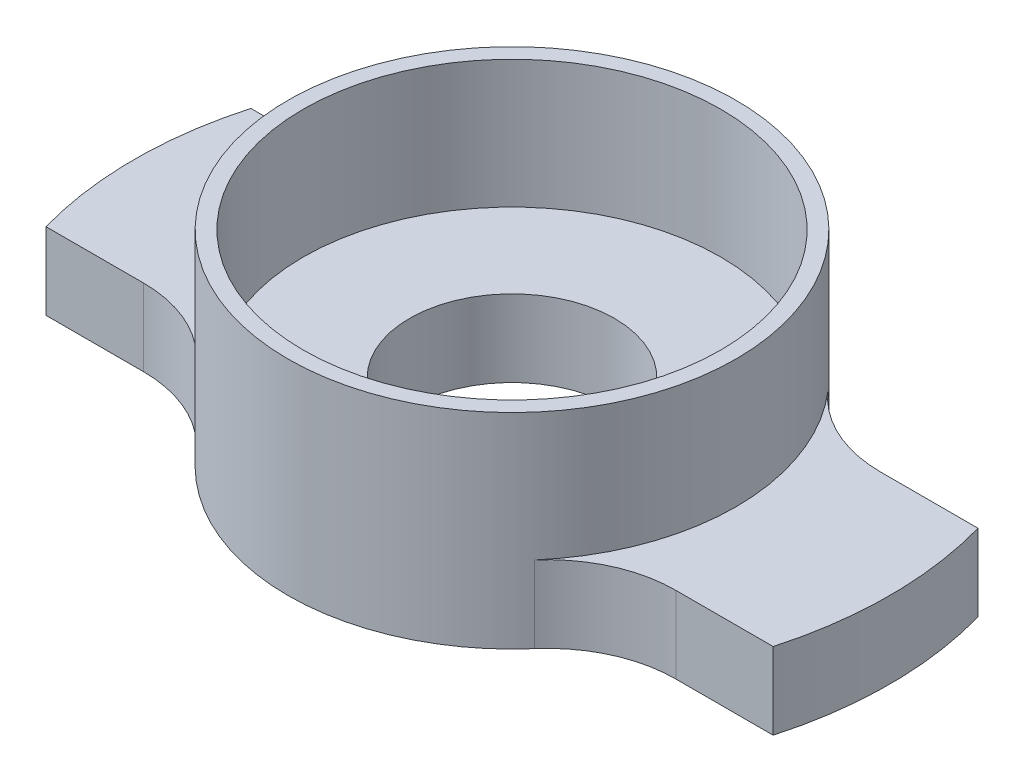
ISO-10303-21;
HEADER;
FILE_DESCRIPTION(('STEP AP214'),'2;1');
FILE_NAME('part.step','',(''),(''),'','','');
FILE_SCHEMA(('AUTOMOTIVE_DESIGN { 1 0 10303 214 1 1 1 1 }'));
ENDSEC;
DATA;
#1=APPLICATION_CONTEXT('core data for automotive mechanical design processes');
#2=APPLICATION_PROTOCOL_DEFINITION('international standard','automotive_design',2000,#1);
#3=PRODUCT_CONTEXT('',#1,'mechanical');
#4=PRODUCT('Part','Part','',(#3));
#5=PRODUCT_RELATED_PRODUCT_CATEGORY('part','',(#4));
#6=PRODUCT_DEFINITION_FORMATION('','',#4);
#7=PRODUCT_DEFINITION_CONTEXT('part definition',#1,'design');
#8=PRODUCT_DEFINITION('design','',#6,#7);
#9=PRODUCT_DEFINITION_SHAPE('','',#8);
#10=(LENGTH_UNIT() NAMED_UNIT(*) SI_UNIT(.MILLI.,.METRE.));
#11=(NAMED_UNIT(*) PLANE_ANGLE_UNIT() SI_UNIT($,.RADIAN.));
#12=(NAMED_UNIT(*) SI_UNIT($,.STERADIAN.) SOLID_ANGLE_UNIT());
#13=UNCERTAINTY_MEASURE_WITH_UNIT(LENGTH_MEASURE(1.E-05),#10,'distance_accuracy_value','');
#14=(GEOMETRIC_REPRESENTATION_CONTEXT(3) GLOBAL_UNCERTAINTY_ASSIGNED_CONTEXT((#13)) GLOBAL_UNIT_ASSIGNED_CONTEXT((#10,
#11,#12)) REPRESENTATION_CONTEXT('',''));
#15=CARTESIAN_POINT('',(0.,0.,0.));
#16=DIRECTION('',(0.,0.,1.));
#17=DIRECTION('',(1.,0.,0.));
#18=AXIS2_PLACEMENT_3D('',#15,#16,#17);
#19=CARTESIAN_POINT('',(0.,10.,0.));
#20=DIRECTION('',(0.,1.,0.));
#21=DIRECTION('',(0.,0.,1.));
#22=AXIS2_PLACEMENT_3D('',#19,#20,#21);
#23=PLANE('',#22);
#24=CARTESIAN_POINT('',(0.,10.,0.));
#25=DIRECTION('',(0.,1.,0.));
#26=DIRECTION('',(0.,0.,1.));
#27=AXIS2_PLACEMENT_3D('',#24,#25,#26);
#28=CIRCLE('',#27,17.5);
#29=CARTESIAN_POINT('',(0.,10.,17.5));
#30=VERTEX_POINT('',#29);
#31=EDGE_CURVE('E192',#30,#30,#28,.T.);
#32=ORIENTED_EDGE('',*,*,#31,.T.);
#33=EDGE_LOOP('',(#32));
#34=FACE_BOUND('',#33,.T.);
#35=CARTESIAN_POINT('',(0.,10.,0.));
#36=DIRECTION('',(0.,1.,0.));
#37=DIRECTION('',(0.,0.,1.));
#38=AXIS2_PLACEMENT_3D('',#35,#36,#37);
#39=CIRCLE('',#38,16.3);
#40=CARTESIAN_POINT('',(0.,10.,16.3));
#41=VERTEX_POINT('',#40);
#42=EDGE_CURVE('E189',#41,#41,#39,.T.);
#43=ORIENTED_EDGE('',*,*,#42,.F.);
#44=EDGE_LOOP('',(#43));
#45=FACE_BOUND('',#44,.T.);
#46=ADVANCED_FACE('F33',(#34,#45),#23,.T.);
#47=CARTESIAN_POINT('',(0.,10.,0.));
#48=DIRECTION('',(0.,-1.,0.));
#49=DIRECTION('',(0.,0.,-1.));
#50=AXIS2_PLACEMENT_3D('',#47,#48,#49);
#51=CYLINDRICAL_SURFACE('',#50,17.5);
#52=ORIENTED_EDGE('',*,*,#31,.F.);
#53=EDGE_LOOP('',(#52));
#54=FACE_BOUND('',#53,.T.);
#55=CARTESIAN_POINT('',(0.,0.,0.));
#56=DIRECTION('',(0.,1.,0.));
#57=DIRECTION('',(0.,0.,1.));
#58=AXIS2_PLACEMENT_3D('',#55,#56,#57);
#59=CIRCLE('',#58,17.5);
#60=CARTESIAN_POINT('',(13.2303963821857,0.,11.4545454545455));
#61=VERTEX_POINT('',#60);
#62=CARTESIAN_POINT('',(13.2303963821857,0.,-11.4545454545455));
#63=VERTEX_POINT('',#62);
#64=EDGE_CURVE('E154',#61,#63,#59,.T.);
#65=ORIENTED_EDGE('',*,*,#64,.T.);
#66=DIRECTION('',(0.,-1.,0.));
#67=VECTOR('',#66,1.);
#68=CARTESIAN_POINT('',(13.2303963821857,10.,-11.4545454545455));
#69=LINE('',#68,#67);
#70=CARTESIAN_POINT('',(13.2303963821857,-6.,-11.4545454545455));
#71=VERTEX_POINT('',#70);
#72=EDGE_CURVE('E207',#63,#71,#69,.T.);
#73=ORIENTED_EDGE('',*,*,#72,.T.);
#74=CARTESIAN_POINT('',(0.,-6.,0.));
#75=DIRECTION('',(0.,-1.,0.));
#76=DIRECTION('',(0.,0.,-1.));
#77=AXIS2_PLACEMENT_3D('',#74,#75,#76);
#78=CIRCLE('',#77,17.5);
#79=CARTESIAN_POINT('',(-13.2303963821857,-6.,-11.4545454545455));
#80=VERTEX_POINT('',#79);
#81=EDGE_CURVE('E188',#80,#71,#78,.T.);
#82=ORIENTED_EDGE('',*,*,#81,.F.);
#83=DIRECTION('',(0.,-1.,0.));
#84=VECTOR('',#83,1.);
#85=CARTESIAN_POINT('',(-13.2303963821857,10.,-11.4545454545455));
#86=LINE('',#85,#84);
#87=CARTESIAN_POINT('',(-13.2303963821857,0.,-11.4545454545455));
#88=VERTEX_POINT('',#87);
#89=EDGE_CURVE('E201',#80,#88,#86,.F.);
#90=ORIENTED_EDGE('',*,*,#89,.T.);
#91=CARTESIAN_POINT('',(0.,0.,0.));
#92=DIRECTION('',(0.,-1.,0.));
#93=DIRECTION('',(0.,0.,-1.));
#94=AXIS2_PLACEMENT_3D('',#91,#92,#93);
#95=CIRCLE('',#94,17.5);
#96=CARTESIAN_POINT('',(-13.2303963821857,0.,11.4545454545455));
#97=VERTEX_POINT('',#96);
#98=EDGE_CURVE('E177',#97,#88,#95,.T.);
#99=ORIENTED_EDGE('',*,*,#98,.F.);
#100=DIRECTION('',(0.,-1.,0.));
#101=VECTOR('',#100,1.);
#102=CARTESIAN_POINT('',(-13.2303963821857,10.,11.4545454545455));
#103=LINE('',#102,#101);
#104=CARTESIAN_POINT('',(-13.2303963821857,-6.,11.4545454545455));
#105=VERTEX_POINT('',#104);
#106=EDGE_CURVE('E198',#97,#105,#103,.T.);
#107=ORIENTED_EDGE('',*,*,#106,.T.);
#108=CARTESIAN_POINT('',(13.2303963821857,-6.,11.4545454545455));
#109=VERTEX_POINT('',#108);
#110=EDGE_CURVE('E184',#109,#105,#78,.T.);
#111=ORIENTED_EDGE('',*,*,#110,.F.);
#112=DIRECTION('',(0.,-1.,0.));
#113=VECTOR('',#112,1.);
#114=CARTESIAN_POINT('',(13.2303963821857,10.,11.4545454545455));
#115=LINE('',#114,#113);
#116=EDGE_CURVE('E204',#109,#61,#115,.F.);
#117=ORIENTED_EDGE('',*,*,#116,.T.);
#118=EDGE_LOOP('',(#65,#73,#82,#90,#99,#107,#111,#117));
#119=FACE_BOUND('',#118,.T.);
#120=ADVANCED_FACE('F238',(#54,#119),#51,.T.);
#121=CARTESIAN_POINT('',(0.,10.,0.));
#122=DIRECTION('',(0.,-1.,0.));
#123=DIRECTION('',(0.,0.,-1.));
#124=AXIS2_PLACEMENT_3D('',#121,#122,#123);
#125=CYLINDRICAL_SURFACE('',#124,16.3);
#126=ORIENTED_EDGE('',*,*,#42,.T.);
#127=EDGE_LOOP('',(#126));
#128=FACE_BOUND('',#127,.T.);
#129=CARTESIAN_POINT('',(0.,0.,0.));
#130=DIRECTION('',(0.,1.,0.));
#131=DIRECTION('',(0.,0.,1.));
#132=AXIS2_PLACEMENT_3D('',#129,#130,#131);
#133=CIRCLE('',#132,16.3);
#134=CARTESIAN_POINT('',(0.,0.,16.3));
#135=VERTEX_POINT('',#134);
#136=EDGE_CURVE('E193',#135,#135,#133,.T.);
#137=ORIENTED_EDGE('',*,*,#136,.F.);
#138=EDGE_LOOP('',(#137));
#139=FACE_BOUND('',#138,.T.);
#140=ADVANCED_FACE('F282',(#128,#139),#125,.F.);
#141=CARTESIAN_POINT('',(0.,0.,0.));
#142=DIRECTION('',(0.,-1.,0.));
#143=DIRECTION('',(0.,0.,-1.));
#144=AXIS2_PLACEMENT_3D('',#141,#142,#143);
#145=PLANE('',#144);
#146=ORIENTED_EDGE('',*,*,#136,.T.);
#147=EDGE_LOOP('',(#146));
#148=FACE_BOUND('',#147,.T.);
#149=CARTESIAN_POINT('',(0.,0.,0.));
#150=DIRECTION('',(0.,-1.,0.));
#151=DIRECTION('',(0.,0.,-1.));
#152=AXIS2_PLACEMENT_3D('',#149,#150,#151);
#153=CIRCLE('',#152,8.);
#154=CARTESIAN_POINT('',(0.,0.,-8.));
#155=VERTEX_POINT('',#154);
#156=EDGE_CURVE('E180',#155,#155,#153,.T.);
#157=ORIENTED_EDGE('',*,*,#156,.T.);
#158=EDGE_LOOP('',(#157));
#159=FACE_BOUND('',#158,.T.);
#160=ADVANCED_FACE('F369',(#148,#159),#145,.F.);
#161=CARTESIAN_POINT('',(0.,-6.,0.));
#162=DIRECTION('',(0.,-1.,0.));
#163=DIRECTION('',(0.,0.,-1.));
#164=AXIS2_PLACEMENT_3D('',#161,#162,#163);
#165=PLANE('',#164);
#166=DIRECTION('',(1.,0.,0.));
#167=VECTOR('',#166,1.);
#168=CARTESIAN_POINT('',(-8.,-6.,-8.));
#169=LINE('',#168,#167);
#170=CARTESIAN_POINT('',(-28.3945417290014,-6.,-8.));
#171=VERTEX_POINT('',#170);
#172=CARTESIAN_POINT('',(-20.7906228862918,-6.,-8.));
#173=VERTEX_POINT('',#172);
#174=EDGE_CURVE('E170',#171,#173,#169,.T.);
#175=ORIENTED_EDGE('',*,*,#174,.T.);
#176=CARTESIAN_POINT('',(-20.7906228862918,-6.,-18.));
#177=DIRECTION('',(0.,-1.,0.));
#178=DIRECTION('',(0.,0.,-1.));
#179=AXIS2_PLACEMENT_3D('',#176,#177,#178);
#180=CIRCLE('',#179,10.);
#181=EDGE_CURVE('E227',#173,#80,#180,.F.);
#182=ORIENTED_EDGE('',*,*,#181,.T.);
#183=ORIENTED_EDGE('',*,*,#81,.T.);
#184=CARTESIAN_POINT('',(20.7906228862918,-6.,-18.));
#185=DIRECTION('',(0.,-1.,0.));
#186=DIRECTION('',(0.,0.,-1.));
#187=AXIS2_PLACEMENT_3D('',#184,#185,#186);
#188=CIRCLE('',#187,10.);
#189=CARTESIAN_POINT('',(20.7906228862918,-6.,-8.));
#190=VERTEX_POINT('',#189);
#191=EDGE_CURVE('E217',#71,#190,#188,.F.);
#192=ORIENTED_EDGE('',*,*,#191,.T.);
#193=DIRECTION('',(1.,0.,0.));
#194=VECTOR('',#193,1.);
#195=CARTESIAN_POINT('',(28.3945417290014,-6.,-8.));
#196=LINE('',#195,#194);
#197=CARTESIAN_POINT('',(28.3945417290014,-6.,-8.));
#198=VERTEX_POINT('',#197);
#199=EDGE_CURVE('E146',#190,#198,#196,.T.);
#200=ORIENTED_EDGE('',*,*,#199,.T.);
#201=CARTESIAN_POINT('',(0.,-6.,0.));
#202=DIRECTION('',(0.,-1.,0.));
#203=DIRECTION('',(0.,0.,1.));
#204=AXIS2_PLACEMENT_3D('',#201,#202,#203);
#205=CIRCLE('',#204,29.5);
#206=CARTESIAN_POINT('',(28.3945417290014,-6.,8.));
#207=VERTEX_POINT('',#206);
#208=EDGE_CURVE('E151',#198,#207,#205,.T.);
#209=ORIENTED_EDGE('',*,*,#208,.T.);
#210=DIRECTION('',(-1.,0.,0.));
#211=VECTOR('',#210,1.);
#212=CARTESIAN_POINT('',(8.,-6.,8.));
#213=LINE('',#212,#211);
#214=CARTESIAN_POINT('',(20.7906228862918,-6.,8.));
#215=VERTEX_POINT('',#214);
#216=EDGE_CURVE('E127',#207,#215,#213,.T.);
#217=ORIENTED_EDGE('',*,*,#216,.T.);
#218=CARTESIAN_POINT('',(20.7906228862918,-6.,18.));
#219=DIRECTION('',(0.,-1.,0.));
#220=DIRECTION('',(0.,0.,-1.));
#221=AXIS2_PLACEMENT_3D('',#218,#219,#220);
#222=CIRCLE('',#221,10.);
#223=EDGE_CURVE('E223',#215,#109,#222,.F.);
#224=ORIENTED_EDGE('',*,*,#223,.T.);
#225=ORIENTED_EDGE('',*,*,#110,.T.);
#226=CARTESIAN_POINT('',(-20.7906228862918,-6.,18.));
#227=DIRECTION('',(0.,-1.,0.));
#228=DIRECTION('',(0.,0.,-1.));
#229=AXIS2_PLACEMENT_3D('',#226,#227,#228);
#230=CIRCLE('',#229,10.);
#231=CARTESIAN_POINT('',(-20.7906228862918,-6.,8.));
#232=VERTEX_POINT('',#231);
#233=EDGE_CURVE('E41',#105,#232,#230,.F.);
#234=ORIENTED_EDGE('',*,*,#233,.T.);
#235=DIRECTION('',(-1.,0.,0.));
#236=VECTOR('',#235,1.);
#237=CARTESIAN_POINT('',(-28.3945417290014,-6.,8.));
#238=LINE('',#237,#236);
#239=CARTESIAN_POINT('',(-28.3945417290014,-6.,8.));
#240=VERTEX_POINT('',#239);
#241=EDGE_CURVE('E162',#232,#240,#238,.T.);
#242=ORIENTED_EDGE('',*,*,#241,.T.);
#243=CARTESIAN_POINT('',(0.,-6.,0.));
#244=DIRECTION('',(0.,-1.,0.));
#245=DIRECTION('',(0.,0.,-1.));
#246=AXIS2_PLACEMENT_3D('',#243,#244,#245);
#247=CIRCLE('',#246,29.5);
#248=EDGE_CURVE('E157',#240,#171,#247,.T.);
#249=ORIENTED_EDGE('',*,*,#248,.T.);
#250=EDGE_LOOP('',(#175,#182,#183,#192,#200,#209,#217,#224,#225,#234,#242,#249));
#251=FACE_BOUND('',#250,.T.);
#252=CARTESIAN_POINT('',(0.,-6.,0.));
#253=DIRECTION('',(0.,-1.,0.));
#254=DIRECTION('',(0.,0.,-1.));
#255=AXIS2_PLACEMENT_3D('',#252,#253,#254);
#256=CIRCLE('',#255,8.);
#257=CARTESIAN_POINT('',(0.,-6.,-8.));
#258=VERTEX_POINT('',#257);
#259=EDGE_CURVE('E181',#258,#258,#256,.T.);
#260=ORIENTED_EDGE('',*,*,#259,.F.);
#261=EDGE_LOOP('',(#260));
#262=FACE_BOUND('',#261,.T.);
#263=ADVANCED_FACE('F231',(#251,#262),#165,.T.);
#264=CARTESIAN_POINT('',(0.,-6.,0.));
#265=DIRECTION('',(0.,1.,0.));
#266=DIRECTION('',(0.,0.,1.));
#267=AXIS2_PLACEMENT_3D('',#264,#265,#266);
#268=CYLINDRICAL_SURFACE('',#267,8.);
#269=ORIENTED_EDGE('',*,*,#156,.F.);
#270=EDGE_LOOP('',(#269));
#271=FACE_BOUND('',#270,.T.);
#272=ORIENTED_EDGE('',*,*,#259,.T.);
#273=EDGE_LOOP('',(#272));
#274=FACE_BOUND('',#273,.T.);
#275=ADVANCED_FACE('F359',(#271,#274),#268,.F.);
#276=CARTESIAN_POINT('',(-28.3945417290014,0.,8.));
#277=DIRECTION('',(0.,0.,1.));
#278=DIRECTION('',(1.,0.,0.));
#279=AXIS2_PLACEMENT_3D('',#276,#277,#278);
#280=PLANE('',#279);
#281=ORIENTED_EDGE('',*,*,#241,.F.);
#282=DIRECTION('',(0.,-1.,0.));
#283=VECTOR('',#282,1.);
#284=CARTESIAN_POINT('',(-20.7906228862918,0.,8.));
#285=LINE('',#284,#283);
#286=CARTESIAN_POINT('',(-20.7906228862918,0.,8.));
#287=VERTEX_POINT('',#286);
#288=EDGE_CURVE('E54',#232,#287,#285,.F.);
#289=ORIENTED_EDGE('',*,*,#288,.T.);
#290=DIRECTION('',(-1.,0.,0.));
#291=VECTOR('',#290,1.);
#292=CARTESIAN_POINT('',(-28.3945417290014,0.,8.));
#293=LINE('',#292,#291);
#294=CARTESIAN_POINT('',(-28.3945417290014,0.,8.));
#295=VERTEX_POINT('',#294);
#296=EDGE_CURVE('E165',#287,#295,#293,.T.);
#297=ORIENTED_EDGE('',*,*,#296,.T.);
#298=DIRECTION('',(0.,-1.,0.));
#299=VECTOR('',#298,1.);
#300=CARTESIAN_POINT('',(-28.3945417290014,0.,8.));
#301=LINE('',#300,#299);
#302=EDGE_CURVE('E174',#295,#240,#301,.T.);
#303=ORIENTED_EDGE('',*,*,#302,.T.);
#304=EDGE_LOOP('',(#281,#289,#297,#303));
#305=FACE_BOUND('',#304,.T.);
#306=ADVANCED_FACE('F350',(#305),#280,.T.);
#307=CARTESIAN_POINT('',(-8.,0.,-8.));
#308=DIRECTION('',(0.,0.,-1.));
#309=DIRECTION('',(-1.,0.,0.));
#310=AXIS2_PLACEMENT_3D('',#307,#308,#309);
#311=PLANE('',#310);
#312=DIRECTION('',(1.,0.,0.));
#313=VECTOR('',#312,1.);
#314=CARTESIAN_POINT('',(-8.,0.,-8.));
#315=LINE('',#314,#313);
#316=CARTESIAN_POINT('',(-28.3945417290014,0.,-8.));
#317=VERTEX_POINT('',#316);
#318=CARTESIAN_POINT('',(-20.7906228862918,0.,-8.));
#319=VERTEX_POINT('',#318);
#320=EDGE_CURVE('E161',#317,#319,#315,.T.);
#321=ORIENTED_EDGE('',*,*,#320,.T.);
#322=DIRECTION('',(0.,-1.,0.));
#323=VECTOR('',#322,1.);
#324=CARTESIAN_POINT('',(-20.7906228862918,0.,-8.));
#325=LINE('',#324,#323);
#326=EDGE_CURVE('E214',#319,#173,#325,.T.);
#327=ORIENTED_EDGE('',*,*,#326,.T.);
#328=ORIENTED_EDGE('',*,*,#174,.F.);
#329=DIRECTION('',(0.,-1.,0.));
#330=VECTOR('',#329,1.);
#331=CARTESIAN_POINT('',(-28.3945417290014,0.,-8.));
#332=LINE('',#331,#330);
#333=EDGE_CURVE('E167',#317,#171,#332,.T.);
#334=ORIENTED_EDGE('',*,*,#333,.F.);
#335=EDGE_LOOP('',(#321,#327,#328,#334));
#336=FACE_BOUND('',#335,.T.);
#337=ADVANCED_FACE('F247',(#336),#311,.T.);
#338=CARTESIAN_POINT('',(0.,0.,0.));
#339=DIRECTION('',(0.,-1.,0.));
#340=DIRECTION('',(0.,0.,-1.));
#341=AXIS2_PLACEMENT_3D('',#338,#339,#340);
#342=CYLINDRICAL_SURFACE('',#341,29.5);
#343=ORIENTED_EDGE('',*,*,#248,.F.);
#344=ORIENTED_EDGE('',*,*,#302,.F.);
#345=CARTESIAN_POINT('',(0.,0.,0.));
#346=DIRECTION('',(0.,-1.,0.));
#347=DIRECTION('',(0.,0.,-1.));
#348=AXIS2_PLACEMENT_3D('',#345,#346,#347);
#349=CIRCLE('',#348,29.5);
#350=EDGE_CURVE('E158',#295,#317,#349,.T.);
#351=ORIENTED_EDGE('',*,*,#350,.T.);
#352=ORIENTED_EDGE('',*,*,#333,.T.);
#353=EDGE_LOOP('',(#343,#344,#351,#352));
#354=FACE_BOUND('',#353,.T.);
#355=ADVANCED_FACE('F250',(#354),#342,.T.);
#356=CARTESIAN_POINT('',(0.,0.,0.));
#357=DIRECTION('',(0.,-1.,0.));
#358=DIRECTION('',(0.,0.,-1.));
#359=AXIS2_PLACEMENT_3D('',#356,#357,#358);
#360=PLANE('',#359);
#361=ORIENTED_EDGE('',*,*,#296,.F.);
#362=CARTESIAN_POINT('',(-20.7906228862918,0.,18.));
#363=DIRECTION('',(0.,-1.,0.));
#364=DIRECTION('',(0.,0.,-1.));
#365=AXIS2_PLACEMENT_3D('',#362,#363,#364);
#366=CIRCLE('',#365,10.);
#367=EDGE_CURVE('E11',#287,#97,#366,.T.);
#368=ORIENTED_EDGE('',*,*,#367,.T.);
#369=ORIENTED_EDGE('',*,*,#98,.T.);
#370=CARTESIAN_POINT('',(-20.7906228862918,0.,-18.));
#371=DIRECTION('',(0.,-1.,0.));
#372=DIRECTION('',(0.,0.,-1.));
#373=AXIS2_PLACEMENT_3D('',#370,#371,#372);
#374=CIRCLE('',#373,10.);
#375=EDGE_CURVE('E225',#88,#319,#374,.T.);
#376=ORIENTED_EDGE('',*,*,#375,.T.);
#377=ORIENTED_EDGE('',*,*,#320,.F.);
#378=ORIENTED_EDGE('',*,*,#350,.F.);
#379=EDGE_LOOP('',(#361,#368,#369,#376,#377,#378));
#380=FACE_BOUND('',#379,.T.);
#381=ADVANCED_FACE('F244',(#380),#360,.F.);
#382=CARTESIAN_POINT('',(28.3945417290014,0.,-8.));
#383=DIRECTION('',(0.,0.,-1.));
#384=DIRECTION('',(-1.,0.,0.));
#385=AXIS2_PLACEMENT_3D('',#382,#383,#384);
#386=PLANE('',#385);
#387=ORIENTED_EDGE('',*,*,#199,.F.);
#388=DIRECTION('',(0.,-1.,0.));
#389=VECTOR('',#388,1.);
#390=CARTESIAN_POINT('',(20.7906228862918,0.,-8.));
#391=LINE('',#390,#389);
#392=CARTESIAN_POINT('',(20.7906228862918,0.,-8.));
#393=VERTEX_POINT('',#392);
#394=EDGE_CURVE('E210',#190,#393,#391,.F.);
#395=ORIENTED_EDGE('',*,*,#394,.T.);
#396=DIRECTION('',(1.,0.,0.));
#397=VECTOR('',#396,1.);
#398=CARTESIAN_POINT('',(28.3945417290014,0.,-8.));
#399=LINE('',#398,#397);
#400=CARTESIAN_POINT('',(28.3945417290014,0.,-8.));
#401=VERTEX_POINT('',#400);
#402=EDGE_CURVE('E133',#393,#401,#399,.T.);
#403=ORIENTED_EDGE('',*,*,#402,.T.);
#404=DIRECTION('',(0.,-1.,0.));
#405=VECTOR('',#404,1.);
#406=CARTESIAN_POINT('',(28.3945417290014,0.,-8.));
#407=LINE('',#406,#405);
#408=EDGE_CURVE('E132',#401,#198,#407,.T.);
#409=ORIENTED_EDGE('',*,*,#408,.T.);
#410=EDGE_LOOP('',(#387,#395,#403,#409));
#411=FACE_BOUND('',#410,.T.);
#412=ADVANCED_FACE('F266',(#411),#386,.T.);
#413=CARTESIAN_POINT('',(8.,0.,8.));
#414=DIRECTION('',(0.,0.,1.));
#415=DIRECTION('',(1.,0.,0.));
#416=AXIS2_PLACEMENT_3D('',#413,#414,#415);
#417=PLANE('',#416);
#418=DIRECTION('',(-1.,0.,0.));
#419=VECTOR('',#418,1.);
#420=CARTESIAN_POINT('',(8.,0.,8.));
#421=LINE('',#420,#419);
#422=CARTESIAN_POINT('',(28.3945417290014,0.,8.));
#423=VERTEX_POINT('',#422);
#424=CARTESIAN_POINT('',(20.7906228862918,0.,8.));
#425=VERTEX_POINT('',#424);
#426=EDGE_CURVE('E124',#423,#425,#421,.T.);
#427=ORIENTED_EDGE('',*,*,#426,.T.);
#428=DIRECTION('',(0.,-1.,0.));
#429=VECTOR('',#428,1.);
#430=CARTESIAN_POINT('',(20.7906228862918,0.,8.));
#431=LINE('',#430,#429);
#432=EDGE_CURVE('E212',#425,#215,#431,.T.);
#433=ORIENTED_EDGE('',*,*,#432,.T.);
#434=ORIENTED_EDGE('',*,*,#216,.F.);
#435=DIRECTION('',(0.,-1.,0.));
#436=VECTOR('',#435,1.);
#437=CARTESIAN_POINT('',(28.3945417290014,0.,8.));
#438=LINE('',#437,#436);
#439=EDGE_CURVE('E121',#423,#207,#438,.T.);
#440=ORIENTED_EDGE('',*,*,#439,.F.);
#441=EDGE_LOOP('',(#427,#433,#434,#440));
#442=FACE_BOUND('',#441,.T.);
#443=ADVANCED_FACE('F123',(#442),#417,.T.);
#444=CARTESIAN_POINT('',(0.,0.,0.));
#445=DIRECTION('',(0.,-1.,0.));
#446=DIRECTION('',(0.,0.,-1.));
#447=AXIS2_PLACEMENT_3D('',#444,#445,#446);
#448=CYLINDRICAL_SURFACE('',#447,29.5);
#449=ORIENTED_EDGE('',*,*,#208,.F.);
#450=ORIENTED_EDGE('',*,*,#408,.F.);
#451=CARTESIAN_POINT('',(0.,0.,0.));
#452=DIRECTION('',(0.,-1.,0.));
#453=DIRECTION('',(0.,0.,1.));
#454=AXIS2_PLACEMENT_3D('',#451,#452,#453);
#455=CIRCLE('',#454,29.5);
#456=EDGE_CURVE('E139',#401,#423,#455,.T.);
#457=ORIENTED_EDGE('',*,*,#456,.T.);
#458=ORIENTED_EDGE('',*,*,#439,.T.);
#459=EDGE_LOOP('',(#449,#450,#457,#458));
#460=FACE_BOUND('',#459,.T.);
#461=ADVANCED_FACE('F144',(#460),#448,.T.);
#462=CARTESIAN_POINT('',(0.,0.,0.));
#463=DIRECTION('',(0.,1.,0.));
#464=DIRECTION('',(0.,0.,1.));
#465=AXIS2_PLACEMENT_3D('',#462,#463,#464);
#466=PLANE('',#465);
#467=ORIENTED_EDGE('',*,*,#64,.F.);
#468=CARTESIAN_POINT('',(20.7906228862918,0.,18.));
#469=DIRECTION('',(0.,1.,0.));
#470=DIRECTION('',(0.,0.,1.));
#471=AXIS2_PLACEMENT_3D('',#468,#469,#470);
#472=CIRCLE('',#471,10.);
#473=EDGE_CURVE('E141',#61,#425,#472,.F.);
#474=ORIENTED_EDGE('',*,*,#473,.T.);
#475=ORIENTED_EDGE('',*,*,#426,.F.);
#476=ORIENTED_EDGE('',*,*,#456,.F.);
#477=ORIENTED_EDGE('',*,*,#402,.F.);
#478=CARTESIAN_POINT('',(20.7906228862918,0.,-18.));
#479=DIRECTION('',(0.,1.,0.));
#480=DIRECTION('',(0.,0.,1.));
#481=AXIS2_PLACEMENT_3D('',#478,#479,#480);
#482=CIRCLE('',#481,10.);
#483=EDGE_CURVE('E219',#393,#63,#482,.F.);
#484=ORIENTED_EDGE('',*,*,#483,.T.);
#485=EDGE_LOOP('',(#467,#474,#475,#476,#477,#484));
#486=FACE_BOUND('',#485,.T.);
#487=ADVANCED_FACE('F137',(#486),#466,.T.);
#488=CARTESIAN_POINT('',(20.7906228862918,10.,-18.));
#489=DIRECTION('',(0.,-1.,0.));
#490=DIRECTION('',(0.,0.,-1.));
#491=AXIS2_PLACEMENT_3D('',#488,#489,#490);
#492=CYLINDRICAL_SURFACE('',#491,10.);
#493=ORIENTED_EDGE('',*,*,#483,.F.);
#494=ORIENTED_EDGE('',*,*,#394,.F.);
#495=ORIENTED_EDGE('',*,*,#191,.F.);
#496=ORIENTED_EDGE('',*,*,#72,.F.);
#497=EDGE_LOOP('',(#493,#494,#495,#496));
#498=FACE_BOUND('',#497,.T.);
#499=ADVANCED_FACE('F263',(#498),#492,.F.);
#500=CARTESIAN_POINT('',(20.7906228862918,10.,18.));
#501=DIRECTION('',(0.,-1.,0.));
#502=DIRECTION('',(0.,0.,-1.));
#503=AXIS2_PLACEMENT_3D('',#500,#501,#502);
#504=CYLINDRICAL_SURFACE('',#503,10.);
#505=ORIENTED_EDGE('',*,*,#223,.F.);
#506=ORIENTED_EDGE('',*,*,#432,.F.);
#507=ORIENTED_EDGE('',*,*,#473,.F.);
#508=ORIENTED_EDGE('',*,*,#116,.F.);
#509=EDGE_LOOP('',(#505,#506,#507,#508));
#510=FACE_BOUND('',#509,.T.);
#511=ADVANCED_FACE('F259',(#510),#504,.F.);
#512=CARTESIAN_POINT('',(-20.7906228862918,10.,-18.));
#513=DIRECTION('',(0.,-1.,0.));
#514=DIRECTION('',(0.,0.,-1.));
#515=AXIS2_PLACEMENT_3D('',#512,#513,#514);
#516=CYLINDRICAL_SURFACE('',#515,10.);
#517=ORIENTED_EDGE('',*,*,#181,.F.);
#518=ORIENTED_EDGE('',*,*,#326,.F.);
#519=ORIENTED_EDGE('',*,*,#375,.F.);
#520=ORIENTED_EDGE('',*,*,#89,.F.);
#521=EDGE_LOOP('',(#517,#518,#519,#520));
#522=FACE_BOUND('',#521,.T.);
#523=ADVANCED_FACE('F241',(#522),#516,.F.);
#524=CARTESIAN_POINT('',(-20.7906228862918,10.,18.));
#525=DIRECTION('',(0.,-1.,0.));
#526=DIRECTION('',(0.,0.,-1.));
#527=AXIS2_PLACEMENT_3D('',#524,#525,#526);
#528=CYLINDRICAL_SURFACE('',#527,10.);
#529=ORIENTED_EDGE('',*,*,#367,.F.);
#530=ORIENTED_EDGE('',*,*,#288,.F.);
#531=ORIENTED_EDGE('',*,*,#233,.F.);
#532=ORIENTED_EDGE('',*,*,#106,.F.);
#533=EDGE_LOOP('',(#529,#530,#531,#532));
#534=FACE_BOUND('',#533,.T.);
#535=ADVANCED_FACE('F35',(#534),#528,.F.);
#536=CLOSED_SHELL('',(#46,#120,#140,#160,#263,#275,#306,#337,#355,#381,#412,#443,#461,#487,#499,
#511,#523,#535));
#537=MANIFOLD_SOLID_BREP('B2',#536);
#538=ADVANCED_BREP_SHAPE_REPRESENTATION('',(#18,#537),#14);
#539=SHAPE_DEFINITION_REPRESENTATION(#9,#538);
ENDSEC;
END-ISO-10303-21;
